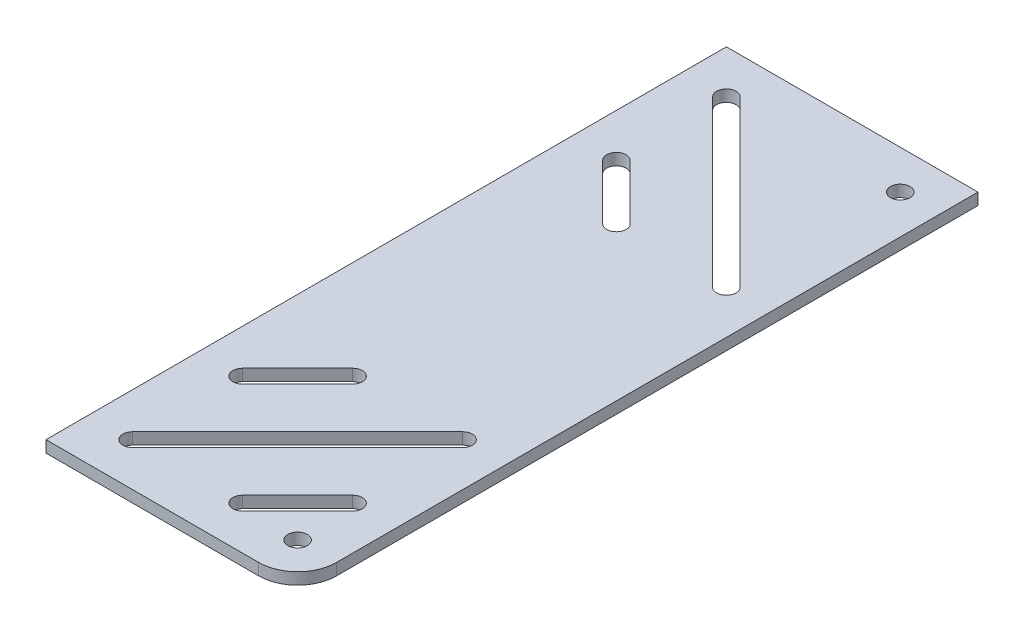
ISO-10303-21;
HEADER;
FILE_DESCRIPTION(('STEP AP214'),'2;1');
FILE_NAME('part.step','',(''),(''),'','','');
FILE_SCHEMA(('AUTOMOTIVE_DESIGN { 1 0 10303 214 1 1 1 1 }'));
ENDSEC;
DATA;
#1=APPLICATION_CONTEXT('core data for automotive mechanical design processes');
#2=APPLICATION_PROTOCOL_DEFINITION('international standard','automotive_design',2000,#1);
#3=PRODUCT_CONTEXT('',#1,'mechanical');
#4=PRODUCT('Part','Part','',(#3));
#5=PRODUCT_RELATED_PRODUCT_CATEGORY('part','',(#4));
#6=PRODUCT_DEFINITION_FORMATION('','',#4);
#7=PRODUCT_DEFINITION_CONTEXT('part definition',#1,'design');
#8=PRODUCT_DEFINITION('design','',#6,#7);
#9=PRODUCT_DEFINITION_SHAPE('','',#8);
#10=(LENGTH_UNIT() NAMED_UNIT(*) SI_UNIT(.MILLI.,.METRE.));
#11=(NAMED_UNIT(*) PLANE_ANGLE_UNIT() SI_UNIT($,.RADIAN.));
#12=(NAMED_UNIT(*) SI_UNIT($,.STERADIAN.) SOLID_ANGLE_UNIT());
#13=UNCERTAINTY_MEASURE_WITH_UNIT(LENGTH_MEASURE(1.E-05),#10,'distance_accuracy_value','');
#14=(GEOMETRIC_REPRESENTATION_CONTEXT(3) GLOBAL_UNCERTAINTY_ASSIGNED_CONTEXT((#13)) GLOBAL_UNIT_ASSIGNED_CONTEXT((#10,
#11,#12)) REPRESENTATION_CONTEXT('',''));
#15=CARTESIAN_POINT('',(0.,0.,0.));
#16=DIRECTION('',(0.,0.,1.));
#17=DIRECTION('',(1.,0.,0.));
#18=AXIS2_PLACEMENT_3D('',#15,#16,#17);
#19=CARTESIAN_POINT('',(180.422470009555,3.,77.4999999999999));
#20=DIRECTION('',(0.,-1.,0.));
#21=DIRECTION('',(0.,0.,-1.));
#22=AXIS2_PLACEMENT_3D('',#19,#20,#21);
#23=PLANE('',#22);
#24=DIRECTION('',(-0.707106781186544,0.,-0.707106781186551));
#25=VECTOR('',#24,1.);
#26=CARTESIAN_POINT('',(138.620155232095,3.,-78.1240920937323));
#27=LINE('',#26,#25);
#28=CARTESIAN_POINT('',(181.046562103288,3.,-35.6976852225393));
#29=VERTEX_POINT('',#28);
#30=CARTESIAN_POINT('',(138.620155232095,3.,-78.1240920937323));
#31=VERTEX_POINT('',#30);
#32=EDGE_CURVE('E323',#29,#31,#27,.T.);
#33=ORIENTED_EDGE('',*,*,#32,.F.);
#34=CARTESIAN_POINT('',(179.278795150321,3.,-33.9299182695729));
#35=DIRECTION('',(0.,1.,0.));
#36=DIRECTION('',(0.,0.,1.));
#37=AXIS2_PLACEMENT_3D('',#34,#35,#36);
#38=CIRCLE('',#37,2.50000000000004);
#39=CARTESIAN_POINT('',(177.511028197355,3.,-32.1621513166065));
#40=VERTEX_POINT('',#39);
#41=EDGE_CURVE('E49',#40,#29,#38,.T.);
#42=ORIENTED_EDGE('',*,*,#41,.F.);
#43=DIRECTION('',(0.707106781186544,0.,0.707106781186551));
#44=VECTOR('',#43,1.);
#45=CARTESIAN_POINT('',(135.084621326162,3.,-74.5885581877996));
#46=LINE('',#45,#44);
#47=CARTESIAN_POINT('',(135.084621326162,3.,-74.5885581877996));
#48=VERTEX_POINT('',#47);
#49=EDGE_CURVE('E312',#48,#40,#46,.T.);
#50=ORIENTED_EDGE('',*,*,#49,.F.);
#51=CARTESIAN_POINT('',(136.852388279129,3.,-76.3563251407659));
#52=DIRECTION('',(0.,1.,0.));
#53=DIRECTION('',(0.,0.,-1.));
#54=AXIS2_PLACEMENT_3D('',#51,#52,#53);
#55=CIRCLE('',#54,2.50000000000004);
#56=EDGE_CURVE('E326',#31,#48,#55,.T.);
#57=ORIENTED_EDGE('',*,*,#56,.F.);
#58=EDGE_LOOP('',(#33,#42,#50,#57));
#59=FACE_BOUND('',#58,.T.);
#60=DIRECTION('',(-0.707106781186542,0.,-0.707106781186553));
#61=VECTOR('',#60,1.);
#62=CARTESIAN_POINT('',(138.620155232096,3.,-49.8398208462715));
#63=LINE('',#62,#61);
#64=CARTESIAN_POINT('',(152.762290855827,3.,-35.6976852225405));
#65=VERTEX_POINT('',#64);
#66=CARTESIAN_POINT('',(138.620155232095,3.,-49.8398208462702));
#67=VERTEX_POINT('',#66);
#68=EDGE_CURVE('E293',#65,#67,#63,.T.);
#69=ORIENTED_EDGE('',*,*,#68,.F.);
#70=CARTESIAN_POINT('',(150.99452390286,3.,-33.9299182695731));
#71=DIRECTION('',(0.,1.,0.));
#72=DIRECTION('',(0.,0.,1.));
#73=AXIS2_PLACEMENT_3D('',#70,#71,#72);
#74=CIRCLE('',#73,2.5);
#75=CARTESIAN_POINT('',(149.226756949894,3.,-32.1621513166078));
#76=VERTEX_POINT('',#75);
#77=EDGE_CURVE('E57',#76,#65,#74,.T.);
#78=ORIENTED_EDGE('',*,*,#77,.F.);
#79=DIRECTION('',(0.707106781186543,0.,0.707106781186552));
#80=VECTOR('',#79,1.);
#81=CARTESIAN_POINT('',(135.084621326163,3.,-46.3042869403388));
#82=LINE('',#81,#80);
#83=CARTESIAN_POINT('',(135.084621326163,3.,-46.3042869403388));
#84=VERTEX_POINT('',#83);
#85=EDGE_CURVE('E282',#84,#76,#82,.T.);
#86=ORIENTED_EDGE('',*,*,#85,.F.);
#87=CARTESIAN_POINT('',(136.852388279129,3.,-48.0720538933039));
#88=DIRECTION('',(0.,1.,0.));
#89=DIRECTION('',(0.,0.,-1.));
#90=AXIS2_PLACEMENT_3D('',#87,#88,#89);
#91=CIRCLE('',#90,2.50000000000002);
#92=EDGE_CURVE('E296',#67,#84,#91,.T.);
#93=ORIENTED_EDGE('',*,*,#92,.F.);
#94=EDGE_LOOP('',(#69,#78,#86,#93));
#95=FACE_BOUND('',#94,.T.);
#96=DIRECTION('',(0.707106781186547,0.,-0.707106781186548));
#97=VECTOR('',#96,1.);
#98=CARTESIAN_POINT('',(138.620155232095,3.,49.8398208462707));
#99=LINE('',#98,#97);
#100=CARTESIAN_POINT('',(138.620155232095,3.,49.8398208462707));
#101=VERTEX_POINT('',#100);
#102=CARTESIAN_POINT('',(152.762290855826,3.,35.6976852225398));
#103=VERTEX_POINT('',#102);
#104=EDGE_CURVE('E262',#101,#103,#99,.T.);
#105=ORIENTED_EDGE('',*,*,#104,.F.);
#106=CARTESIAN_POINT('',(136.852388279129,3.,48.0720538933043));
#107=DIRECTION('',(0.,1.,0.));
#108=DIRECTION('',(0.,0.,1.));
#109=AXIS2_PLACEMENT_3D('',#106,#107,#108);
#110=CIRCLE('',#109,2.50000000000005);
#111=CARTESIAN_POINT('',(135.084621326162,3.,46.3042869403379));
#112=VERTEX_POINT('',#111);
#113=EDGE_CURVE('E260',#112,#101,#110,.T.);
#114=ORIENTED_EDGE('',*,*,#113,.F.);
#115=DIRECTION('',(-0.707106781186549,0.,0.707106781186546));
#116=VECTOR('',#115,1.);
#117=CARTESIAN_POINT('',(135.084621326162,3.,46.3042869403379));
#118=LINE('',#117,#116);
#119=CARTESIAN_POINT('',(149.226756949893,3.,32.162151316607));
#120=VERTEX_POINT('',#119);
#121=EDGE_CURVE('E250',#120,#112,#118,.T.);
#122=ORIENTED_EDGE('',*,*,#121,.F.);
#123=CARTESIAN_POINT('',(150.99452390286,3.,33.9299182695734));
#124=DIRECTION('',(0.,1.,0.));
#125=DIRECTION('',(0.,0.,-1.));
#126=AXIS2_PLACEMENT_3D('',#123,#124,#125);
#127=CIRCLE('',#126,2.50000000000003);
#128=EDGE_CURVE('E266',#103,#120,#127,.T.);
#129=ORIENTED_EDGE('',*,*,#128,.F.);
#130=EDGE_LOOP('',(#105,#114,#122,#129));
#131=FACE_BOUND('',#130,.T.);
#132=DIRECTION('',(0.707106781186546,0.,-0.707106781186549));
#133=VECTOR('',#132,1.);
#134=CARTESIAN_POINT('',(166.904426479557,3.,78.1240920937325));
#135=LINE('',#134,#133);
#136=CARTESIAN_POINT('',(166.904426479557,3.,78.1240920937325));
#137=VERTEX_POINT('',#136);
#138=CARTESIAN_POINT('',(181.046562103288,3.,63.9819564700018));
#139=VERTEX_POINT('',#138);
#140=EDGE_CURVE('E235',#137,#139,#135,.T.);
#141=ORIENTED_EDGE('',*,*,#140,.F.);
#142=CARTESIAN_POINT('',(165.136659526591,3.,76.3563251407661));
#143=DIRECTION('',(0.,1.,0.));
#144=DIRECTION('',(0.,0.,1.));
#145=AXIS2_PLACEMENT_3D('',#142,#143,#144);
#146=CIRCLE('',#145,2.50000000000005);
#147=CARTESIAN_POINT('',(163.368892573624,3.,74.5885581877997));
#148=VERTEX_POINT('',#147);
#149=EDGE_CURVE('E208',#148,#137,#146,.T.);
#150=ORIENTED_EDGE('',*,*,#149,.F.);
#151=DIRECTION('',(-0.707106781186549,0.,0.707106781186546));
#152=VECTOR('',#151,1.);
#153=CARTESIAN_POINT('',(163.368892573624,3.,74.5885581877997));
#154=LINE('',#153,#152);
#155=CARTESIAN_POINT('',(177.511028197355,3.,60.4464225640688));
#156=VERTEX_POINT('',#155);
#157=EDGE_CURVE('E226',#156,#148,#154,.T.);
#158=ORIENTED_EDGE('',*,*,#157,.F.);
#159=CARTESIAN_POINT('',(179.278795150322,3.,62.2141895170354));
#160=DIRECTION('',(0.,1.,0.));
#161=DIRECTION('',(0.,0.,-1.));
#162=AXIS2_PLACEMENT_3D('',#159,#160,#161);
#163=CIRCLE('',#162,2.50000000000002);
#164=EDGE_CURVE('E229',#139,#156,#163,.T.);
#165=ORIENTED_EDGE('',*,*,#164,.F.);
#166=EDGE_LOOP('',(#141,#150,#158,#165));
#167=FACE_BOUND('',#166,.T.);
#168=DIRECTION('',(0.707106781186548,0.,-0.707106781186547));
#169=VECTOR('',#168,1.);
#170=CARTESIAN_POINT('',(138.620155232095,3.,78.1240920937325));
#171=LINE('',#170,#169);
#172=CARTESIAN_POINT('',(138.620155232095,3.,78.1240920937325));
#173=VERTEX_POINT('',#172);
#174=CARTESIAN_POINT('',(181.046562103288,3.,35.6976852225397));
#175=VERTEX_POINT('',#174);
#176=EDGE_CURVE('E352',#173,#175,#171,.T.);
#177=ORIENTED_EDGE('',*,*,#176,.F.);
#178=CARTESIAN_POINT('',(136.852388279129,3.,76.3563251407661));
#179=DIRECTION('',(0.,1.,0.));
#180=DIRECTION('',(0.,0.,1.));
#181=AXIS2_PLACEMENT_3D('',#178,#179,#180);
#182=CIRCLE('',#181,2.50000000000005);
#183=CARTESIAN_POINT('',(135.084621326162,3.,74.5885581877997));
#184=VERTEX_POINT('',#183);
#185=EDGE_CURVE('E242',#184,#173,#182,.T.);
#186=ORIENTED_EDGE('',*,*,#185,.F.);
#187=DIRECTION('',(-0.707106781186549,0.,0.707106781186546));
#188=VECTOR('',#187,1.);
#189=CARTESIAN_POINT('',(135.084621326162,3.,74.5885581877997));
#190=LINE('',#189,#188);
#191=CARTESIAN_POINT('',(177.511028197355,3.,32.1621513166069));
#192=VERTEX_POINT('',#191);
#193=EDGE_CURVE('E341',#192,#184,#190,.T.);
#194=ORIENTED_EDGE('',*,*,#193,.F.);
#195=CARTESIAN_POINT('',(179.278795150322,3.,33.9299182695733));
#196=DIRECTION('',(0.,1.,0.));
#197=DIRECTION('',(0.,0.,-1.));
#198=AXIS2_PLACEMENT_3D('',#195,#196,#197);
#199=CIRCLE('',#198,2.50000000000002);
#200=EDGE_CURVE('E355',#175,#192,#199,.T.);
#201=ORIENTED_EDGE('',*,*,#200,.F.);
#202=EDGE_LOOP('',(#177,#186,#194,#201));
#203=FACE_BOUND('',#202,.T.);
#204=DIRECTION('',(0.,0.,-1.));
#205=VECTOR('',#204,1.);
#206=CARTESIAN_POINT('',(190.422470009556,3.,-87.5000000000002));
#207=LINE('',#206,#205);
#208=CARTESIAN_POINT('',(190.422470009556,3.,77.4999999999999));
#209=VERTEX_POINT('',#208);
#210=CARTESIAN_POINT('',(190.422470009556,3.,-87.5000000000002));
#211=VERTEX_POINT('',#210);
#212=EDGE_CURVE('E381',#209,#211,#207,.T.);
#213=ORIENTED_EDGE('',*,*,#212,.T.);
#214=DIRECTION('',(-1.,0.,0.));
#215=VECTOR('',#214,1.);
#216=CARTESIAN_POINT('',(180.422470009555,3.,-87.5000000000002));
#217=LINE('',#216,#215);
#218=CARTESIAN_POINT('',(125.708713419895,3.,-87.5000000000002));
#219=VERTEX_POINT('',#218);
#220=EDGE_CURVE('E384',#211,#219,#217,.T.);
#221=ORIENTED_EDGE('',*,*,#220,.T.);
#222=DIRECTION('',(0.,0.,1.));
#223=VECTOR('',#222,1.);
#224=CARTESIAN_POINT('',(125.708713419895,3.,-87.5000000000002));
#225=LINE('',#224,#223);
#226=CARTESIAN_POINT('',(125.708713419895,3.,87.5));
#227=VERTEX_POINT('',#226);
#228=EDGE_CURVE('E387',#219,#227,#225,.T.);
#229=ORIENTED_EDGE('',*,*,#228,.T.);
#230=DIRECTION('',(1.,0.,0.));
#231=VECTOR('',#230,1.);
#232=CARTESIAN_POINT('',(180.422470009556,3.,87.4999999999999));
#233=LINE('',#232,#231);
#234=CARTESIAN_POINT('',(180.422470009556,3.,87.4999999999999));
#235=VERTEX_POINT('',#234);
#236=EDGE_CURVE('E389',#227,#235,#233,.T.);
#237=ORIENTED_EDGE('',*,*,#236,.T.);
#238=CARTESIAN_POINT('',(180.422470009555,3.,77.4999999999999));
#239=DIRECTION('',(0.,1.,0.));
#240=DIRECTION('',(0.,0.,-1.));
#241=AXIS2_PLACEMENT_3D('',#238,#239,#240);
#242=CIRCLE('',#241,10.0000000000001);
#243=EDGE_CURVE('E391',#235,#209,#242,.T.);
#244=ORIENTED_EDGE('',*,*,#243,.T.);
#245=EDGE_LOOP('',(#213,#221,#229,#237,#244));
#246=FACE_BOUND('',#245,.T.);
#247=CARTESIAN_POINT('',(180.422470009556,3.,-77.5000000000001));
#248=DIRECTION('',(0.,1.,0.));
#249=DIRECTION('',(0.,0.,1.));
#250=AXIS2_PLACEMENT_3D('',#247,#248,#249);
#251=CIRCLE('',#250,2.5);
#252=CARTESIAN_POINT('',(180.422470009556,3.,-75.0000000000001));
#253=VERTEX_POINT('',#252);
#254=EDGE_CURVE('E375',#253,#253,#251,.T.);
#255=ORIENTED_EDGE('',*,*,#254,.F.);
#256=EDGE_LOOP('',(#255));
#257=FACE_BOUND('',#256,.T.);
#258=CARTESIAN_POINT('',(180.422470009555,3.,77.4999999999999));
#259=DIRECTION('',(0.,1.,0.));
#260=DIRECTION('',(0.,0.,1.));
#261=AXIS2_PLACEMENT_3D('',#258,#259,#260);
#262=CIRCLE('',#261,2.5);
#263=CARTESIAN_POINT('',(180.422470009555,3.,79.9999999999999));
#264=VERTEX_POINT('',#263);
#265=EDGE_CURVE('E369',#264,#264,#262,.T.);
#266=ORIENTED_EDGE('',*,*,#265,.F.);
#267=EDGE_LOOP('',(#266));
#268=FACE_BOUND('',#267,.T.);
#269=ADVANCED_FACE('F34',(#59,#95,#131,#167,#203,#246,#257,#268),#23,.F.);
#270=CARTESIAN_POINT('',(180.422470009555,0.,77.4999999999999));
#271=DIRECTION('',(0.,-1.,0.));
#272=DIRECTION('',(0.,0.,-1.));
#273=AXIS2_PLACEMENT_3D('',#270,#271,#272);
#274=PLANE('',#273);
#275=CARTESIAN_POINT('',(179.278795150321,0.,-33.9299182695729));
#276=DIRECTION('',(0.,1.,0.));
#277=DIRECTION('',(0.,0.,1.));
#278=AXIS2_PLACEMENT_3D('',#275,#276,#277);
#279=CIRCLE('',#278,2.50000000000004);
#280=CARTESIAN_POINT('',(177.511028197355,0.,-32.1621513166065));
#281=VERTEX_POINT('',#280);
#282=CARTESIAN_POINT('',(181.046562103288,0.,-35.6976852225393));
#283=VERTEX_POINT('',#282);
#284=EDGE_CURVE('E308',#281,#283,#279,.T.);
#285=ORIENTED_EDGE('',*,*,#284,.T.);
#286=DIRECTION('',(-0.707106781186544,0.,-0.707106781186551));
#287=VECTOR('',#286,1.);
#288=CARTESIAN_POINT('',(138.620155232095,0.,-78.1240920937323));
#289=LINE('',#288,#287);
#290=CARTESIAN_POINT('',(138.620155232095,0.,-78.1240920937323));
#291=VERTEX_POINT('',#290);
#292=EDGE_CURVE('E311',#283,#291,#289,.T.);
#293=ORIENTED_EDGE('',*,*,#292,.T.);
#294=CARTESIAN_POINT('',(136.852388279129,0.,-76.3563251407659));
#295=DIRECTION('',(0.,1.,0.));
#296=DIRECTION('',(0.,0.,-1.));
#297=AXIS2_PLACEMENT_3D('',#294,#295,#296);
#298=CIRCLE('',#297,2.50000000000004);
#299=CARTESIAN_POINT('',(135.084621326162,0.,-74.5885581877996));
#300=VERTEX_POINT('',#299);
#301=EDGE_CURVE('E315',#291,#300,#298,.T.);
#302=ORIENTED_EDGE('',*,*,#301,.T.);
#303=DIRECTION('',(0.707106781186544,0.,0.707106781186551));
#304=VECTOR('',#303,1.);
#305=CARTESIAN_POINT('',(135.084621326162,0.,-74.5885581877996));
#306=LINE('',#305,#304);
#307=EDGE_CURVE('E318',#300,#281,#306,.T.);
#308=ORIENTED_EDGE('',*,*,#307,.T.);
#309=EDGE_LOOP('',(#285,#293,#302,#308));
#310=FACE_BOUND('',#309,.T.);
#311=CARTESIAN_POINT('',(150.99452390286,0.,-33.9299182695731));
#312=DIRECTION('',(0.,1.,0.));
#313=DIRECTION('',(0.,0.,1.));
#314=AXIS2_PLACEMENT_3D('',#311,#312,#313);
#315=CIRCLE('',#314,2.5);
#316=CARTESIAN_POINT('',(149.226756949894,0.,-32.1621513166078));
#317=VERTEX_POINT('',#316);
#318=CARTESIAN_POINT('',(152.762290855827,0.,-35.6976852225405));
#319=VERTEX_POINT('',#318);
#320=EDGE_CURVE('E278',#317,#319,#315,.T.);
#321=ORIENTED_EDGE('',*,*,#320,.T.);
#322=DIRECTION('',(-0.707106781186542,0.,-0.707106781186553));
#323=VECTOR('',#322,1.);
#324=CARTESIAN_POINT('',(138.620155232096,0.,-49.8398208462715));
#325=LINE('',#324,#323);
#326=CARTESIAN_POINT('',(138.620155232097,0.,-49.8398208462702));
#327=VERTEX_POINT('',#326);
#328=EDGE_CURVE('E281',#319,#327,#325,.T.);
#329=ORIENTED_EDGE('',*,*,#328,.T.);
#330=CARTESIAN_POINT('',(136.852388279129,0.,-48.0720538933039));
#331=DIRECTION('',(0.,1.,0.));
#332=DIRECTION('',(0.,0.,-1.));
#333=AXIS2_PLACEMENT_3D('',#330,#331,#332);
#334=CIRCLE('',#333,2.50000000000002);
#335=CARTESIAN_POINT('',(135.084621326163,0.,-46.3042869403388));
#336=VERTEX_POINT('',#335);
#337=EDGE_CURVE('E285',#327,#336,#334,.T.);
#338=ORIENTED_EDGE('',*,*,#337,.T.);
#339=DIRECTION('',(0.707106781186543,0.,0.707106781186552));
#340=VECTOR('',#339,1.);
#341=CARTESIAN_POINT('',(135.084621326163,0.,-46.3042869403388));
#342=LINE('',#341,#340);
#343=EDGE_CURVE('E288',#336,#317,#342,.T.);
#344=ORIENTED_EDGE('',*,*,#343,.T.);
#345=EDGE_LOOP('',(#321,#329,#338,#344));
#346=FACE_BOUND('',#345,.T.);
#347=CARTESIAN_POINT('',(136.852388279129,0.,48.0720538933043));
#348=DIRECTION('',(0.,1.,0.));
#349=DIRECTION('',(0.,0.,1.));
#350=AXIS2_PLACEMENT_3D('',#347,#348,#349);
#351=CIRCLE('',#350,2.50000000000005);
#352=CARTESIAN_POINT('',(135.084621326162,0.,46.3042869403379));
#353=VERTEX_POINT('',#352);
#354=CARTESIAN_POINT('',(138.620155232095,0.,49.8398208462707));
#355=VERTEX_POINT('',#354);
#356=EDGE_CURVE('E246',#353,#355,#351,.T.);
#357=ORIENTED_EDGE('',*,*,#356,.T.);
#358=DIRECTION('',(0.707106781186547,0.,-0.707106781186548));
#359=VECTOR('',#358,1.);
#360=CARTESIAN_POINT('',(138.620155232095,0.,49.8398208462707));
#361=LINE('',#360,#359);
#362=CARTESIAN_POINT('',(152.762290855826,0.,35.6976852225398));
#363=VERTEX_POINT('',#362);
#364=EDGE_CURVE('E249',#355,#363,#361,.T.);
#365=ORIENTED_EDGE('',*,*,#364,.T.);
#366=CARTESIAN_POINT('',(150.99452390286,0.,33.9299182695734));
#367=DIRECTION('',(0.,1.,0.));
#368=DIRECTION('',(0.,0.,-1.));
#369=AXIS2_PLACEMENT_3D('',#366,#367,#368);
#370=CIRCLE('',#369,2.50000000000003);
#371=CARTESIAN_POINT('',(149.226756949893,0.,32.162151316607));
#372=VERTEX_POINT('',#371);
#373=EDGE_CURVE('E253',#363,#372,#370,.T.);
#374=ORIENTED_EDGE('',*,*,#373,.T.);
#375=DIRECTION('',(-0.707106781186549,0.,0.707106781186546));
#376=VECTOR('',#375,1.);
#377=CARTESIAN_POINT('',(135.084621326162,0.,46.3042869403379));
#378=LINE('',#377,#376);
#379=EDGE_CURVE('E256',#372,#353,#378,.T.);
#380=ORIENTED_EDGE('',*,*,#379,.T.);
#381=EDGE_LOOP('',(#357,#365,#374,#380));
#382=FACE_BOUND('',#381,.T.);
#383=CARTESIAN_POINT('',(165.136659526591,0.,76.3563251407661));
#384=DIRECTION('',(0.,1.,0.));
#385=DIRECTION('',(0.,0.,1.));
#386=AXIS2_PLACEMENT_3D('',#383,#384,#385);
#387=CIRCLE('',#386,2.50000000000005);
#388=CARTESIAN_POINT('',(163.368892573624,0.,74.5885581877997));
#389=VERTEX_POINT('',#388);
#390=CARTESIAN_POINT('',(166.904426479557,0.,78.1240920937325));
#391=VERTEX_POINT('',#390);
#392=EDGE_CURVE('E205',#389,#391,#387,.T.);
#393=ORIENTED_EDGE('',*,*,#392,.T.);
#394=DIRECTION('',(0.707106781186546,0.,-0.707106781186549));
#395=VECTOR('',#394,1.);
#396=CARTESIAN_POINT('',(166.904426479557,0.,78.1240920937325));
#397=LINE('',#396,#395);
#398=CARTESIAN_POINT('',(181.046562103288,0.,63.9819564700018));
#399=VERTEX_POINT('',#398);
#400=EDGE_CURVE('E217',#391,#399,#397,.T.);
#401=ORIENTED_EDGE('',*,*,#400,.T.);
#402=CARTESIAN_POINT('',(179.278795150322,0.,62.2141895170354));
#403=DIRECTION('',(0.,1.,0.));
#404=DIRECTION('',(0.,0.,-1.));
#405=AXIS2_PLACEMENT_3D('',#402,#403,#404);
#406=CIRCLE('',#405,2.50000000000002);
#407=CARTESIAN_POINT('',(177.511028197355,0.,60.4464225640688));
#408=VERTEX_POINT('',#407);
#409=EDGE_CURVE('E221',#399,#408,#406,.T.);
#410=ORIENTED_EDGE('',*,*,#409,.T.);
#411=DIRECTION('',(-0.707106781186549,0.,0.707106781186546));
#412=VECTOR('',#411,1.);
#413=CARTESIAN_POINT('',(163.368892573624,0.,74.5885581877997));
#414=LINE('',#413,#412);
#415=EDGE_CURVE('E213',#408,#389,#414,.T.);
#416=ORIENTED_EDGE('',*,*,#415,.T.);
#417=EDGE_LOOP('',(#393,#401,#410,#416));
#418=FACE_BOUND('',#417,.T.);
#419=CARTESIAN_POINT('',(136.852388279129,0.,76.3563251407661));
#420=DIRECTION('',(0.,1.,0.));
#421=DIRECTION('',(0.,0.,1.));
#422=AXIS2_PLACEMENT_3D('',#419,#420,#421);
#423=CIRCLE('',#422,2.50000000000005);
#424=CARTESIAN_POINT('',(135.084621326162,0.,74.5885581877997));
#425=VERTEX_POINT('',#424);
#426=CARTESIAN_POINT('',(138.620155232095,0.,78.1240920937325));
#427=VERTEX_POINT('',#426);
#428=EDGE_CURVE('E337',#425,#427,#423,.T.);
#429=ORIENTED_EDGE('',*,*,#428,.T.);
#430=DIRECTION('',(0.707106781186548,0.,-0.707106781186547));
#431=VECTOR('',#430,1.);
#432=CARTESIAN_POINT('',(138.620155232095,0.,78.1240920937325));
#433=LINE('',#432,#431);
#434=CARTESIAN_POINT('',(181.046562103288,0.,35.6976852225397));
#435=VERTEX_POINT('',#434);
#436=EDGE_CURVE('E340',#427,#435,#433,.T.);
#437=ORIENTED_EDGE('',*,*,#436,.T.);
#438=CARTESIAN_POINT('',(179.278795150322,0.,33.9299182695733));
#439=DIRECTION('',(0.,1.,0.));
#440=DIRECTION('',(0.,0.,-1.));
#441=AXIS2_PLACEMENT_3D('',#438,#439,#440);
#442=CIRCLE('',#441,2.50000000000002);
#443=CARTESIAN_POINT('',(177.511028197355,0.,32.1621513166069));
#444=VERTEX_POINT('',#443);
#445=EDGE_CURVE('E344',#435,#444,#442,.T.);
#446=ORIENTED_EDGE('',*,*,#445,.T.);
#447=DIRECTION('',(-0.707106781186549,0.,0.707106781186546));
#448=VECTOR('',#447,1.);
#449=CARTESIAN_POINT('',(135.084621326162,0.,74.5885581877997));
#450=LINE('',#449,#448);
#451=EDGE_CURVE('E347',#444,#425,#450,.T.);
#452=ORIENTED_EDGE('',*,*,#451,.T.);
#453=EDGE_LOOP('',(#429,#437,#446,#452));
#454=FACE_BOUND('',#453,.T.);
#455=CARTESIAN_POINT('',(180.422470009556,0.,-77.5000000000001));
#456=DIRECTION('',(0.,1.,0.));
#457=DIRECTION('',(0.,0.,1.));
#458=AXIS2_PLACEMENT_3D('',#455,#456,#457);
#459=CIRCLE('',#458,2.5);
#460=CARTESIAN_POINT('',(180.422470009556,0.,-75.0000000000001));
#461=VERTEX_POINT('',#460);
#462=EDGE_CURVE('E372',#461,#461,#459,.T.);
#463=ORIENTED_EDGE('',*,*,#462,.T.);
#464=EDGE_LOOP('',(#463));
#465=FACE_BOUND('',#464,.T.);
#466=DIRECTION('',(-1.,0.,0.));
#467=VECTOR('',#466,1.);
#468=CARTESIAN_POINT('',(125.708713419895,0.,-87.5000000000002));
#469=LINE('',#468,#467);
#470=CARTESIAN_POINT('',(190.422470009556,0.,-87.5000000000002));
#471=VERTEX_POINT('',#470);
#472=CARTESIAN_POINT('',(125.708713419895,0.,-87.5000000000002));
#473=VERTEX_POINT('',#472);
#474=EDGE_CURVE('E378',#471,#473,#469,.T.);
#475=ORIENTED_EDGE('',*,*,#474,.F.);
#476=DIRECTION('',(0.,0.,-1.));
#477=VECTOR('',#476,1.);
#478=CARTESIAN_POINT('',(190.422470009556,0.,-77.5000000000001));
#479=LINE('',#478,#477);
#480=CARTESIAN_POINT('',(190.422470009556,0.,77.4999999999999));
#481=VERTEX_POINT('',#480);
#482=EDGE_CURVE('E385',#481,#471,#479,.T.);
#483=ORIENTED_EDGE('',*,*,#482,.F.);
#484=CARTESIAN_POINT('',(180.422470009555,0.,77.4999999999999));
#485=DIRECTION('',(0.,1.,0.));
#486=DIRECTION('',(0.,0.,-1.));
#487=AXIS2_PLACEMENT_3D('',#484,#485,#486);
#488=CIRCLE('',#487,10.0000000000001);
#489=CARTESIAN_POINT('',(180.422470009556,0.,87.4999999999999));
#490=VERTEX_POINT('',#489);
#491=EDGE_CURVE('E400',#490,#481,#488,.T.);
#492=ORIENTED_EDGE('',*,*,#491,.F.);
#493=DIRECTION('',(1.,0.,0.));
#494=VECTOR('',#493,1.);
#495=CARTESIAN_POINT('',(180.422470009556,0.,87.4999999999999));
#496=LINE('',#495,#494);
#497=CARTESIAN_POINT('',(125.708713419895,0.,87.5));
#498=VERTEX_POINT('',#497);
#499=EDGE_CURVE('E398',#498,#490,#496,.T.);
#500=ORIENTED_EDGE('',*,*,#499,.F.);
#501=DIRECTION('',(0.,0.,1.));
#502=VECTOR('',#501,1.);
#503=CARTESIAN_POINT('',(125.708713419895,0.,-87.5000000000002));
#504=LINE('',#503,#502);
#505=EDGE_CURVE('E396',#473,#498,#504,.T.);
#506=ORIENTED_EDGE('',*,*,#505,.F.);
#507=EDGE_LOOP('',(#475,#483,#492,#500,#506));
#508=FACE_BOUND('',#507,.T.);
#509=CARTESIAN_POINT('',(180.422470009555,0.,77.4999999999999));
#510=DIRECTION('',(0.,1.,0.));
#511=DIRECTION('',(0.,0.,1.));
#512=AXIS2_PLACEMENT_3D('',#509,#510,#511);
#513=CIRCLE('',#512,2.5);
#514=CARTESIAN_POINT('',(180.422470009555,0.,79.9999999999999));
#515=VERTEX_POINT('',#514);
#516=EDGE_CURVE('E362',#515,#515,#513,.T.);
#517=ORIENTED_EDGE('',*,*,#516,.T.);
#518=EDGE_LOOP('',(#517));
#519=FACE_BOUND('',#518,.T.);
#520=ADVANCED_FACE('F223',(#310,#346,#382,#418,#454,#465,#508,#519),#274,.T.);
#521=CARTESIAN_POINT('',(125.708713419895,3.,-87.5000000000002));
#522=DIRECTION('',(0.,0.,1.));
#523=DIRECTION('',(1.,0.,0.));
#524=AXIS2_PLACEMENT_3D('',#521,#522,#523);
#525=PLANE('',#524);
#526=ORIENTED_EDGE('',*,*,#474,.T.);
#527=DIRECTION('',(0.,-1.,0.));
#528=VECTOR('',#527,1.);
#529=CARTESIAN_POINT('',(125.708713419895,3.,-87.5000000000002));
#530=LINE('',#529,#528);
#531=EDGE_CURVE('E42',#219,#473,#530,.T.);
#532=ORIENTED_EDGE('',*,*,#531,.F.);
#533=ORIENTED_EDGE('',*,*,#220,.F.);
#534=DIRECTION('',(0.,-1.,0.));
#535=VECTOR('',#534,1.);
#536=CARTESIAN_POINT('',(190.422470009556,3.,-87.5000000000002));
#537=LINE('',#536,#535);
#538=EDGE_CURVE('E11',#211,#471,#537,.T.);
#539=ORIENTED_EDGE('',*,*,#538,.T.);
#540=EDGE_LOOP('',(#526,#532,#533,#539));
#541=FACE_BOUND('',#540,.T.);
#542=ADVANCED_FACE('F36',(#541),#525,.F.);
#543=CARTESIAN_POINT('',(125.708713419895,3.,-87.5000000000002));
#544=DIRECTION('',(1.,0.,0.));
#545=DIRECTION('',(0.,0.,-1.));
#546=AXIS2_PLACEMENT_3D('',#543,#544,#545);
#547=PLANE('',#546);
#548=ORIENTED_EDGE('',*,*,#505,.T.);
#549=DIRECTION('',(0.,-1.,0.));
#550=VECTOR('',#549,1.);
#551=CARTESIAN_POINT('',(125.708713419895,3.,87.5));
#552=LINE('',#551,#550);
#553=EDGE_CURVE('E409',#227,#498,#552,.T.);
#554=ORIENTED_EDGE('',*,*,#553,.F.);
#555=ORIENTED_EDGE('',*,*,#228,.F.);
#556=ORIENTED_EDGE('',*,*,#531,.T.);
#557=EDGE_LOOP('',(#548,#554,#555,#556));
#558=FACE_BOUND('',#557,.T.);
#559=ADVANCED_FACE('F416',(#558),#547,.F.);
#560=CARTESIAN_POINT('',(180.422470009556,3.,87.4999999999999));
#561=DIRECTION('',(0.,0.,-1.));
#562=DIRECTION('',(-1.,0.,0.));
#563=AXIS2_PLACEMENT_3D('',#560,#561,#562);
#564=PLANE('',#563);
#565=ORIENTED_EDGE('',*,*,#499,.T.);
#566=DIRECTION('',(0.,-1.,0.));
#567=VECTOR('',#566,1.);
#568=CARTESIAN_POINT('',(180.422470009556,3.,87.4999999999999));
#569=LINE('',#568,#567);
#570=EDGE_CURVE('E406',#235,#490,#569,.T.);
#571=ORIENTED_EDGE('',*,*,#570,.F.);
#572=ORIENTED_EDGE('',*,*,#236,.F.);
#573=ORIENTED_EDGE('',*,*,#553,.T.);
#574=EDGE_LOOP('',(#565,#571,#572,#573));
#575=FACE_BOUND('',#574,.T.);
#576=ADVANCED_FACE('F426',(#575),#564,.F.);
#577=CARTESIAN_POINT('',(180.422470009555,3.,77.4999999999999));
#578=DIRECTION('',(0.,-1.,0.));
#579=DIRECTION('',(0.,0.,-1.));
#580=AXIS2_PLACEMENT_3D('',#577,#578,#579);
#581=CYLINDRICAL_SURFACE('',#580,10.0000000000001);
#582=ORIENTED_EDGE('',*,*,#491,.T.);
#583=DIRECTION('',(0.,-1.,0.));
#584=VECTOR('',#583,1.);
#585=CARTESIAN_POINT('',(190.422470009556,3.,77.4999999999999));
#586=LINE('',#585,#584);
#587=EDGE_CURVE('E394',#209,#481,#586,.T.);
#588=ORIENTED_EDGE('',*,*,#587,.F.);
#589=ORIENTED_EDGE('',*,*,#243,.F.);
#590=ORIENTED_EDGE('',*,*,#570,.T.);
#591=EDGE_LOOP('',(#582,#588,#589,#590));
#592=FACE_BOUND('',#591,.T.);
#593=ADVANCED_FACE('F430',(#592),#581,.T.);
#594=CARTESIAN_POINT('',(190.422470009556,3.,-77.5000000000001));
#595=DIRECTION('',(-1.,0.,0.));
#596=DIRECTION('',(0.,0.,1.));
#597=AXIS2_PLACEMENT_3D('',#594,#595,#596);
#598=PLANE('',#597);
#599=ORIENTED_EDGE('',*,*,#482,.T.);
#600=ORIENTED_EDGE('',*,*,#538,.F.);
#601=ORIENTED_EDGE('',*,*,#212,.F.);
#602=ORIENTED_EDGE('',*,*,#587,.T.);
#603=EDGE_LOOP('',(#599,#600,#601,#602));
#604=FACE_BOUND('',#603,.T.);
#605=ADVANCED_FACE('F436',(#604),#598,.F.);
#606=CARTESIAN_POINT('',(180.422470009556,3.,-77.5000000000001));
#607=DIRECTION('',(0.,-1.,0.));
#608=DIRECTION('',(0.,0.,-1.));
#609=AXIS2_PLACEMENT_3D('',#606,#607,#608);
#610=CYLINDRICAL_SURFACE('',#609,2.5);
#611=ORIENTED_EDGE('',*,*,#254,.T.);
#612=EDGE_LOOP('',(#611));
#613=FACE_BOUND('',#612,.T.);
#614=ORIENTED_EDGE('',*,*,#462,.F.);
#615=EDGE_LOOP('',(#614));
#616=FACE_BOUND('',#615,.T.);
#617=ADVANCED_FACE('F438',(#613,#616),#610,.F.);
#618=CARTESIAN_POINT('',(180.422470009555,3.,77.4999999999999));
#619=DIRECTION('',(0.,-1.,0.));
#620=DIRECTION('',(0.,0.,-1.));
#621=AXIS2_PLACEMENT_3D('',#618,#619,#620);
#622=CYLINDRICAL_SURFACE('',#621,2.5);
#623=ORIENTED_EDGE('',*,*,#265,.T.);
#624=EDGE_LOOP('',(#623));
#625=FACE_BOUND('',#624,.T.);
#626=ORIENTED_EDGE('',*,*,#516,.F.);
#627=EDGE_LOOP('',(#626));
#628=FACE_BOUND('',#627,.T.);
#629=ADVANCED_FACE('F444',(#625,#628),#622,.F.);
#630=CARTESIAN_POINT('',(136.852388279129,0.,76.3563251407661));
#631=DIRECTION('',(0.,1.,0.));
#632=DIRECTION('',(0.,0.,1.));
#633=AXIS2_PLACEMENT_3D('',#630,#631,#632);
#634=CYLINDRICAL_SURFACE('',#633,2.50000000000005);
#635=ORIENTED_EDGE('',*,*,#185,.T.);
#636=DIRECTION('',(0.,1.,0.));
#637=VECTOR('',#636,1.);
#638=CARTESIAN_POINT('',(138.620155232095,0.,78.1240920937325));
#639=LINE('',#638,#637);
#640=EDGE_CURVE('E350',#427,#173,#639,.T.);
#641=ORIENTED_EDGE('',*,*,#640,.F.);
#642=ORIENTED_EDGE('',*,*,#428,.F.);
#643=DIRECTION('',(0.,1.,0.));
#644=VECTOR('',#643,1.);
#645=CARTESIAN_POINT('',(135.084621326162,0.,74.5885581877997));
#646=LINE('',#645,#644);
#647=EDGE_CURVE('E360',#425,#184,#646,.T.);
#648=ORIENTED_EDGE('',*,*,#647,.T.);
#649=EDGE_LOOP('',(#635,#641,#642,#648));
#650=FACE_BOUND('',#649,.T.);
#651=ADVANCED_FACE('F461',(#650),#634,.F.);
#652=CARTESIAN_POINT('',(135.084621326162,0.,74.5885581877997));
#653=DIRECTION('',(-0.707106781186546,0.,-0.707106781186548));
#654=DIRECTION('',(-0.707106781186549,0.,0.707106781186546));
#655=AXIS2_PLACEMENT_3D('',#652,#653,#654);
#656=PLANE('',#655);
#657=ORIENTED_EDGE('',*,*,#193,.T.);
#658=ORIENTED_EDGE('',*,*,#647,.F.);
#659=ORIENTED_EDGE('',*,*,#451,.F.);
#660=DIRECTION('',(0.,1.,0.));
#661=VECTOR('',#660,1.);
#662=CARTESIAN_POINT('',(177.511028197355,0.,32.1621513166069));
#663=LINE('',#662,#661);
#664=EDGE_CURVE('E363',#444,#192,#663,.T.);
#665=ORIENTED_EDGE('',*,*,#664,.T.);
#666=EDGE_LOOP('',(#657,#658,#659,#665));
#667=FACE_BOUND('',#666,.T.);
#668=ADVANCED_FACE('F465',(#667),#656,.F.);
#669=CARTESIAN_POINT('',(179.278795150322,0.,33.9299182695733));
#670=DIRECTION('',(0.,1.,0.));
#671=DIRECTION('',(0.,0.,1.));
#672=AXIS2_PLACEMENT_3D('',#669,#670,#671);
#673=CYLINDRICAL_SURFACE('',#672,2.50000000000002);
#674=ORIENTED_EDGE('',*,*,#200,.T.);
#675=ORIENTED_EDGE('',*,*,#664,.F.);
#676=ORIENTED_EDGE('',*,*,#445,.F.);
#677=DIRECTION('',(0.,1.,0.));
#678=VECTOR('',#677,1.);
#679=CARTESIAN_POINT('',(181.046562103288,0.,35.6976852225397));
#680=LINE('',#679,#678);
#681=EDGE_CURVE('E365',#435,#175,#680,.T.);
#682=ORIENTED_EDGE('',*,*,#681,.T.);
#683=EDGE_LOOP('',(#674,#675,#676,#682));
#684=FACE_BOUND('',#683,.T.);
#685=ADVANCED_FACE('F470',(#684),#673,.F.);
#686=CARTESIAN_POINT('',(138.620155232095,0.,78.1240920937325));
#687=DIRECTION('',(0.707106781186547,0.,0.707106781186548));
#688=DIRECTION('',(0.707106781186548,0.,-0.707106781186547));
#689=AXIS2_PLACEMENT_3D('',#686,#687,#688);
#690=PLANE('',#689);
#691=ORIENTED_EDGE('',*,*,#176,.T.);
#692=ORIENTED_EDGE('',*,*,#681,.F.);
#693=ORIENTED_EDGE('',*,*,#436,.F.);
#694=ORIENTED_EDGE('',*,*,#640,.T.);
#695=EDGE_LOOP('',(#691,#692,#693,#694));
#696=FACE_BOUND('',#695,.T.);
#697=ADVANCED_FACE('F467',(#696),#690,.F.);
#698=CARTESIAN_POINT('',(165.136659526591,0.,76.3563251407661));
#699=DIRECTION('',(0.,1.,0.));
#700=DIRECTION('',(0.,0.,1.));
#701=AXIS2_PLACEMENT_3D('',#698,#699,#700);
#702=CYLINDRICAL_SURFACE('',#701,2.50000000000005);
#703=ORIENTED_EDGE('',*,*,#149,.T.);
#704=DIRECTION('',(0.,1.,0.));
#705=VECTOR('',#704,1.);
#706=CARTESIAN_POINT('',(166.904426479557,0.,78.1240920937325));
#707=LINE('',#706,#705);
#708=EDGE_CURVE('E201',#391,#137,#707,.T.);
#709=ORIENTED_EDGE('',*,*,#708,.F.);
#710=ORIENTED_EDGE('',*,*,#392,.F.);
#711=DIRECTION('',(0.,1.,0.));
#712=VECTOR('',#711,1.);
#713=CARTESIAN_POINT('',(163.368892573624,0.,74.5885581877997));
#714=LINE('',#713,#712);
#715=EDGE_CURVE('E240',#389,#148,#714,.T.);
#716=ORIENTED_EDGE('',*,*,#715,.T.);
#717=EDGE_LOOP('',(#703,#709,#710,#716));
#718=FACE_BOUND('',#717,.T.);
#719=ADVANCED_FACE('F203',(#718),#702,.F.);
#720=CARTESIAN_POINT('',(163.368892573624,0.,74.5885581877997));
#721=DIRECTION('',(-0.707106781186546,0.,-0.707106781186549));
#722=DIRECTION('',(-0.707106781186549,0.,0.707106781186546));
#723=AXIS2_PLACEMENT_3D('',#720,#721,#722);
#724=PLANE('',#723);
#725=ORIENTED_EDGE('',*,*,#157,.T.);
#726=ORIENTED_EDGE('',*,*,#715,.F.);
#727=ORIENTED_EDGE('',*,*,#415,.F.);
#728=DIRECTION('',(0.,1.,0.));
#729=VECTOR('',#728,1.);
#730=CARTESIAN_POINT('',(177.511028197355,0.,60.4464225640688));
#731=LINE('',#730,#729);
#732=EDGE_CURVE('E243',#408,#156,#731,.T.);
#733=ORIENTED_EDGE('',*,*,#732,.T.);
#734=EDGE_LOOP('',(#725,#726,#727,#733));
#735=FACE_BOUND('',#734,.T.);
#736=ADVANCED_FACE('F526',(#735),#724,.F.);
#737=CARTESIAN_POINT('',(179.278795150322,0.,62.2141895170354));
#738=DIRECTION('',(0.,1.,0.));
#739=DIRECTION('',(0.,0.,1.));
#740=AXIS2_PLACEMENT_3D('',#737,#738,#739);
#741=CYLINDRICAL_SURFACE('',#740,2.50000000000002);
#742=ORIENTED_EDGE('',*,*,#164,.T.);
#743=ORIENTED_EDGE('',*,*,#732,.F.);
#744=ORIENTED_EDGE('',*,*,#409,.F.);
#745=DIRECTION('',(0.,1.,0.));
#746=VECTOR('',#745,1.);
#747=CARTESIAN_POINT('',(181.046562103288,0.,63.9819564700018));
#748=LINE('',#747,#746);
#749=EDGE_CURVE('E212',#399,#139,#748,.T.);
#750=ORIENTED_EDGE('',*,*,#749,.T.);
#751=EDGE_LOOP('',(#742,#743,#744,#750));
#752=FACE_BOUND('',#751,.T.);
#753=ADVANCED_FACE('F529',(#752),#741,.F.);
#754=CARTESIAN_POINT('',(166.904426479557,0.,78.1240920937325));
#755=DIRECTION('',(0.707106781186548,0.,0.707106781186546));
#756=DIRECTION('',(0.707106781186546,0.,-0.707106781186549));
#757=AXIS2_PLACEMENT_3D('',#754,#755,#756);
#758=PLANE('',#757);
#759=ORIENTED_EDGE('',*,*,#140,.T.);
#760=ORIENTED_EDGE('',*,*,#749,.F.);
#761=ORIENTED_EDGE('',*,*,#400,.F.);
#762=ORIENTED_EDGE('',*,*,#708,.T.);
#763=EDGE_LOOP('',(#759,#760,#761,#762));
#764=FACE_BOUND('',#763,.T.);
#765=ADVANCED_FACE('F218',(#764),#758,.F.);
#766=CARTESIAN_POINT('',(136.852388279129,0.,48.0720538933043));
#767=DIRECTION('',(0.,1.,0.));
#768=DIRECTION('',(0.,0.,1.));
#769=AXIS2_PLACEMENT_3D('',#766,#767,#768);
#770=CYLINDRICAL_SURFACE('',#769,2.50000000000005);
#771=ORIENTED_EDGE('',*,*,#113,.T.);
#772=DIRECTION('',(0.,1.,0.));
#773=VECTOR('',#772,1.);
#774=CARTESIAN_POINT('',(138.620155232095,0.,49.8398208462707));
#775=LINE('',#774,#773);
#776=EDGE_CURVE('E259',#355,#101,#775,.T.);
#777=ORIENTED_EDGE('',*,*,#776,.F.);
#778=ORIENTED_EDGE('',*,*,#356,.F.);
#779=DIRECTION('',(0.,1.,0.));
#780=VECTOR('',#779,1.);
#781=CARTESIAN_POINT('',(135.084621326162,0.,46.3042869403379));
#782=LINE('',#781,#780);
#783=EDGE_CURVE('E236',#353,#112,#782,.T.);
#784=ORIENTED_EDGE('',*,*,#783,.T.);
#785=EDGE_LOOP('',(#771,#777,#778,#784));
#786=FACE_BOUND('',#785,.T.);
#787=ADVANCED_FACE('F509',(#786),#770,.F.);
#788=CARTESIAN_POINT('',(135.084621326162,0.,46.3042869403379));
#789=DIRECTION('',(-0.707106781186546,0.,-0.707106781186548));
#790=DIRECTION('',(-0.707106781186549,0.,0.707106781186546));
#791=AXIS2_PLACEMENT_3D('',#788,#789,#790);
#792=PLANE('',#791);
#793=ORIENTED_EDGE('',*,*,#121,.T.);
#794=ORIENTED_EDGE('',*,*,#783,.F.);
#795=ORIENTED_EDGE('',*,*,#379,.F.);
#796=DIRECTION('',(0.,1.,0.));
#797=VECTOR('',#796,1.);
#798=CARTESIAN_POINT('',(149.226756949893,0.,32.162151316607));
#799=LINE('',#798,#797);
#800=EDGE_CURVE('E272',#372,#120,#799,.T.);
#801=ORIENTED_EDGE('',*,*,#800,.T.);
#802=EDGE_LOOP('',(#793,#794,#795,#801));
#803=FACE_BOUND('',#802,.T.);
#804=ADVANCED_FACE('F512',(#803),#792,.F.);
#805=CARTESIAN_POINT('',(150.99452390286,0.,33.9299182695734));
#806=DIRECTION('',(0.,1.,0.));
#807=DIRECTION('',(0.,0.,1.));
#808=AXIS2_PLACEMENT_3D('',#805,#806,#807);
#809=CYLINDRICAL_SURFACE('',#808,2.50000000000003);
#810=ORIENTED_EDGE('',*,*,#128,.T.);
#811=ORIENTED_EDGE('',*,*,#800,.F.);
#812=ORIENTED_EDGE('',*,*,#373,.F.);
#813=DIRECTION('',(0.,1.,0.));
#814=VECTOR('',#813,1.);
#815=CARTESIAN_POINT('',(152.762290855826,0.,35.6976852225398));
#816=LINE('',#815,#814);
#817=EDGE_CURVE('E274',#363,#103,#816,.T.);
#818=ORIENTED_EDGE('',*,*,#817,.T.);
#819=EDGE_LOOP('',(#810,#811,#812,#818));
#820=FACE_BOUND('',#819,.T.);
#821=ADVANCED_FACE('F516',(#820),#809,.F.);
#822=CARTESIAN_POINT('',(138.620155232095,0.,49.8398208462707));
#823=DIRECTION('',(0.707106781186548,0.,0.707106781186547));
#824=DIRECTION('',(0.707106781186547,0.,-0.707106781186548));
#825=AXIS2_PLACEMENT_3D('',#822,#823,#824);
#826=PLANE('',#825);
#827=ORIENTED_EDGE('',*,*,#104,.T.);
#828=ORIENTED_EDGE('',*,*,#817,.F.);
#829=ORIENTED_EDGE('',*,*,#364,.F.);
#830=ORIENTED_EDGE('',*,*,#776,.T.);
#831=EDGE_LOOP('',(#827,#828,#829,#830));
#832=FACE_BOUND('',#831,.T.);
#833=ADVANCED_FACE('F498',(#832),#826,.F.);
#834=CARTESIAN_POINT('',(150.99452390286,0.,-33.9299182695731));
#835=DIRECTION('',(0.,1.,0.));
#836=DIRECTION('',(0.,0.,1.));
#837=AXIS2_PLACEMENT_3D('',#834,#835,#836);
#838=CYLINDRICAL_SURFACE('',#837,2.5);
#839=ORIENTED_EDGE('',*,*,#77,.T.);
#840=DIRECTION('',(0.,1.,0.));
#841=VECTOR('',#840,1.);
#842=CARTESIAN_POINT('',(152.762290855827,0.,-35.6976852225405));
#843=LINE('',#842,#841);
#844=EDGE_CURVE('E291',#319,#65,#843,.T.);
#845=ORIENTED_EDGE('',*,*,#844,.F.);
#846=ORIENTED_EDGE('',*,*,#320,.F.);
#847=DIRECTION('',(0.,1.,0.));
#848=VECTOR('',#847,1.);
#849=CARTESIAN_POINT('',(149.226756949894,0.,-32.1621513166078));
#850=LINE('',#849,#848);
#851=EDGE_CURVE('E301',#317,#76,#850,.T.);
#852=ORIENTED_EDGE('',*,*,#851,.T.);
#853=EDGE_LOOP('',(#839,#845,#846,#852));
#854=FACE_BOUND('',#853,.T.);
#855=ADVANCED_FACE('F494',(#854),#838,.F.);
#856=CARTESIAN_POINT('',(135.084621326163,0.,-46.3042869403388));
#857=DIRECTION('',(-0.707106781186552,0.,0.707106781186543));
#858=DIRECTION('',(0.707106781186543,0.,0.707106781186552));
#859=AXIS2_PLACEMENT_3D('',#856,#857,#858);
#860=PLANE('',#859);
#861=ORIENTED_EDGE('',*,*,#85,.T.);
#862=ORIENTED_EDGE('',*,*,#851,.F.);
#863=ORIENTED_EDGE('',*,*,#343,.F.);
#864=DIRECTION('',(0.,1.,0.));
#865=VECTOR('',#864,1.);
#866=CARTESIAN_POINT('',(135.084621326163,0.,-46.3042869403388));
#867=LINE('',#866,#865);
#868=EDGE_CURVE('E303',#336,#84,#867,.T.);
#869=ORIENTED_EDGE('',*,*,#868,.T.);
#870=EDGE_LOOP('',(#861,#862,#863,#869));
#871=FACE_BOUND('',#870,.T.);
#872=ADVANCED_FACE('F497',(#871),#860,.F.);
#873=CARTESIAN_POINT('',(136.852388279129,0.,-48.0720538933039));
#874=DIRECTION('',(0.,1.,0.));
#875=DIRECTION('',(0.,0.,1.));
#876=AXIS2_PLACEMENT_3D('',#873,#874,#875);
#877=CYLINDRICAL_SURFACE('',#876,2.50000000000002);
#878=ORIENTED_EDGE('',*,*,#92,.T.);
#879=ORIENTED_EDGE('',*,*,#868,.F.);
#880=ORIENTED_EDGE('',*,*,#337,.F.);
#881=DIRECTION('',(0.,1.,0.));
#882=VECTOR('',#881,1.);
#883=CARTESIAN_POINT('',(138.620155232095,0.,-49.8398208462702));
#884=LINE('',#883,#882);
#885=EDGE_CURVE('E305',#327,#67,#884,.T.);
#886=ORIENTED_EDGE('',*,*,#885,.T.);
#887=EDGE_LOOP('',(#878,#879,#880,#886));
#888=FACE_BOUND('',#887,.T.);
#889=ADVANCED_FACE('F501',(#888),#877,.F.);
#890=CARTESIAN_POINT('',(138.620155232096,0.,-49.8398208462715));
#891=DIRECTION('',(0.707106781186553,0.,-0.707106781186542));
#892=DIRECTION('',(-0.707106781186542,0.,-0.707106781186553));
#893=AXIS2_PLACEMENT_3D('',#890,#891,#892);
#894=PLANE('',#893);
#895=ORIENTED_EDGE('',*,*,#68,.T.);
#896=ORIENTED_EDGE('',*,*,#885,.F.);
#897=ORIENTED_EDGE('',*,*,#328,.F.);
#898=ORIENTED_EDGE('',*,*,#844,.T.);
#899=EDGE_LOOP('',(#895,#896,#897,#898));
#900=FACE_BOUND('',#899,.T.);
#901=ADVANCED_FACE('F482',(#900),#894,.F.);
#902=CARTESIAN_POINT('',(179.278795150321,0.,-33.9299182695729));
#903=DIRECTION('',(0.,1.,0.));
#904=DIRECTION('',(0.,0.,1.));
#905=AXIS2_PLACEMENT_3D('',#902,#903,#904);
#906=CYLINDRICAL_SURFACE('',#905,2.50000000000004);
#907=ORIENTED_EDGE('',*,*,#41,.T.);
#908=DIRECTION('',(0.,1.,0.));
#909=VECTOR('',#908,1.);
#910=CARTESIAN_POINT('',(181.046562103288,0.,-35.6976852225393));
#911=LINE('',#910,#909);
#912=EDGE_CURVE('E321',#283,#29,#911,.T.);
#913=ORIENTED_EDGE('',*,*,#912,.F.);
#914=ORIENTED_EDGE('',*,*,#284,.F.);
#915=DIRECTION('',(0.,1.,0.));
#916=VECTOR('',#915,1.);
#917=CARTESIAN_POINT('',(177.511028197355,0.,-32.1621513166065));
#918=LINE('',#917,#916);
#919=EDGE_CURVE('E263',#281,#40,#918,.T.);
#920=ORIENTED_EDGE('',*,*,#919,.T.);
#921=EDGE_LOOP('',(#907,#913,#914,#920));
#922=FACE_BOUND('',#921,.T.);
#923=ADVANCED_FACE('F478',(#922),#906,.F.);
#924=CARTESIAN_POINT('',(135.084621326162,0.,-74.5885581877996));
#925=DIRECTION('',(-0.707106781186551,0.,0.707106781186544));
#926=DIRECTION('',(0.707106781186544,0.,0.707106781186551));
#927=AXIS2_PLACEMENT_3D('',#924,#925,#926);
#928=PLANE('',#927);
#929=ORIENTED_EDGE('',*,*,#49,.T.);
#930=ORIENTED_EDGE('',*,*,#919,.F.);
#931=ORIENTED_EDGE('',*,*,#307,.F.);
#932=DIRECTION('',(0.,1.,0.));
#933=VECTOR('',#932,1.);
#934=CARTESIAN_POINT('',(135.084621326162,0.,-74.5885581877996));
#935=LINE('',#934,#933);
#936=EDGE_CURVE('E332',#300,#48,#935,.T.);
#937=ORIENTED_EDGE('',*,*,#936,.T.);
#938=EDGE_LOOP('',(#929,#930,#931,#937));
#939=FACE_BOUND('',#938,.T.);
#940=ADVANCED_FACE('F481',(#939),#928,.F.);
#941=CARTESIAN_POINT('',(136.852388279129,0.,-76.3563251407659));
#942=DIRECTION('',(0.,1.,0.));
#943=DIRECTION('',(0.,0.,1.));
#944=AXIS2_PLACEMENT_3D('',#941,#942,#943);
#945=CYLINDRICAL_SURFACE('',#944,2.50000000000004);
#946=ORIENTED_EDGE('',*,*,#56,.T.);
#947=ORIENTED_EDGE('',*,*,#936,.F.);
#948=ORIENTED_EDGE('',*,*,#301,.F.);
#949=DIRECTION('',(0.,1.,0.));
#950=VECTOR('',#949,1.);
#951=CARTESIAN_POINT('',(138.620155232095,0.,-78.1240920937323));
#952=LINE('',#951,#950);
#953=EDGE_CURVE('E334',#291,#31,#952,.T.);
#954=ORIENTED_EDGE('',*,*,#953,.T.);
#955=EDGE_LOOP('',(#946,#947,#948,#954));
#956=FACE_BOUND('',#955,.T.);
#957=ADVANCED_FACE('F486',(#956),#945,.F.);
#958=CARTESIAN_POINT('',(138.620155232095,0.,-78.1240920937323));
#959=DIRECTION('',(0.707106781186551,0.,-0.707106781186544));
#960=DIRECTION('',(-0.707106781186544,0.,-0.707106781186551));
#961=AXIS2_PLACEMENT_3D('',#958,#959,#960);
#962=PLANE('',#961);
#963=ORIENTED_EDGE('',*,*,#32,.T.);
#964=ORIENTED_EDGE('',*,*,#953,.F.);
#965=ORIENTED_EDGE('',*,*,#292,.F.);
#966=ORIENTED_EDGE('',*,*,#912,.T.);
#967=EDGE_LOOP('',(#963,#964,#965,#966));
#968=FACE_BOUND('',#967,.T.);
#969=ADVANCED_FACE('F483',(#968),#962,.F.);
#970=CLOSED_SHELL('',(#269,#520,#542,#559,#576,#593,#605,#617,#629,#651,#668,#685,#697,#719,
#736,#753,#765,#787,#804,#821,#833,#855,#872,#889,#901,#923,#940,#957,#969));
#971=MANIFOLD_SOLID_BREP('B2',#970);
#972=ADVANCED_BREP_SHAPE_REPRESENTATION('',(#18,#971),#14);
#973=SHAPE_DEFINITION_REPRESENTATION(#9,#972);
ENDSEC;
END-ISO-10303-21;
